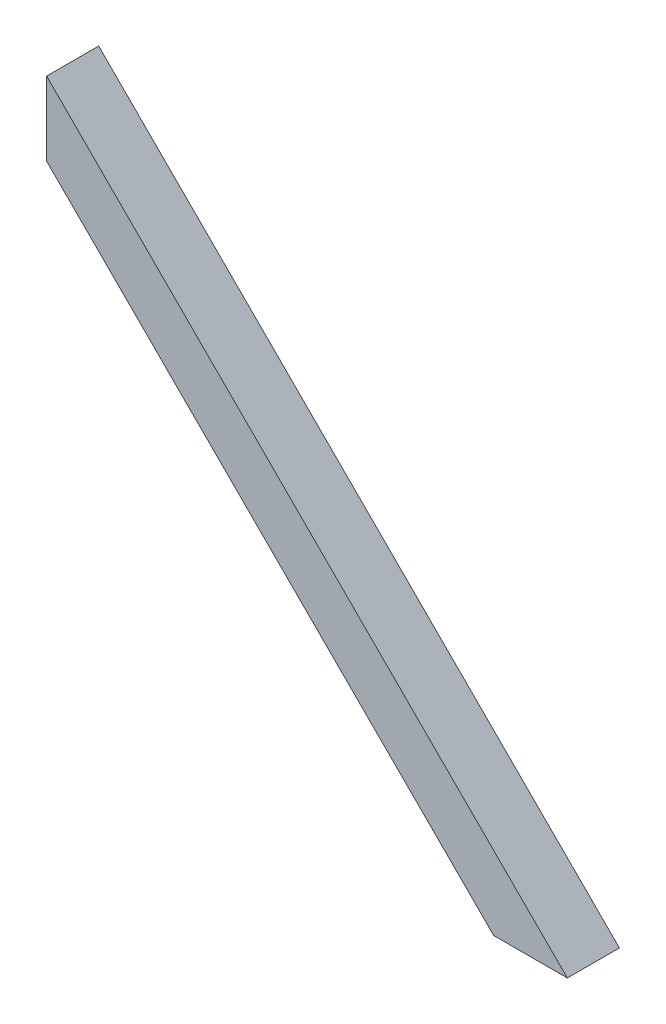
ISO-10303-21;
HEADER;
FILE_DESCRIPTION(('STEP AP214'),'2;1');
FILE_NAME('part.step','',(''),(''),'','','');
FILE_SCHEMA(('AUTOMOTIVE_DESIGN { 1 0 10303 214 1 1 1 1 }'));
ENDSEC;
DATA;
#1=APPLICATION_CONTEXT('core data for automotive mechanical design processes');
#2=APPLICATION_PROTOCOL_DEFINITION('international standard','automotive_design',2000,#1);
#3=PRODUCT_CONTEXT('',#1,'mechanical');
#4=PRODUCT('Part','Part','',(#3));
#5=PRODUCT_RELATED_PRODUCT_CATEGORY('part','',(#4));
#6=PRODUCT_DEFINITION_FORMATION('','',#4);
#7=PRODUCT_DEFINITION_CONTEXT('part definition',#1,'design');
#8=PRODUCT_DEFINITION('design','',#6,#7);
#9=PRODUCT_DEFINITION_SHAPE('','',#8);
#10=(LENGTH_UNIT() NAMED_UNIT(*) SI_UNIT(.MILLI.,.METRE.));
#11=(NAMED_UNIT(*) PLANE_ANGLE_UNIT() SI_UNIT($,.RADIAN.));
#12=(NAMED_UNIT(*) SI_UNIT($,.STERADIAN.) SOLID_ANGLE_UNIT());
#13=UNCERTAINTY_MEASURE_WITH_UNIT(LENGTH_MEASURE(1.E-05),#10,'distance_accuracy_value','');
#14=(GEOMETRIC_REPRESENTATION_CONTEXT(3) GLOBAL_UNCERTAINTY_ASSIGNED_CONTEXT((#13)) GLOBAL_UNIT_ASSIGNED_CONTEXT((#10,
#11,#12)) REPRESENTATION_CONTEXT('',''));
#15=CARTESIAN_POINT('',(0.,0.,0.));
#16=DIRECTION('',(0.,0.,1.));
#17=DIRECTION('',(1.,0.,0.));
#18=AXIS2_PLACEMENT_3D('',#15,#16,#17);
#19=CARTESIAN_POINT('',(0.,0.,30.));
#20=DIRECTION('',(1.,0.,0.));
#21=DIRECTION('',(0.,1.,0.));
#22=AXIS2_PLACEMENT_3D('',#19,#20,#21);
#23=PLANE('',#22);
#24=DIRECTION('',(0.,-1.,0.));
#25=VECTOR('',#24,1.);
#26=CARTESIAN_POINT('',(0.,0.,0.));
#27=LINE('',#26,#25);
#28=CARTESIAN_POINT('',(0.,300.,0.));
#29=VERTEX_POINT('',#28);
#30=CARTESIAN_POINT('',(0.,257.573593128807,0.));
#31=VERTEX_POINT('',#30);
#32=EDGE_CURVE('E100',#29,#31,#27,.T.);
#33=ORIENTED_EDGE('',*,*,#32,.T.);
#34=DIRECTION('',(0.,0.,-1.));
#35=VECTOR('',#34,1.);
#36=CARTESIAN_POINT('',(0.,257.573593128807,30.));
#37=LINE('',#36,#35);
#38=CARTESIAN_POINT('',(0.,257.573593128807,30.));
#39=VERTEX_POINT('',#38);
#40=EDGE_CURVE('E11',#39,#31,#37,.T.);
#41=ORIENTED_EDGE('',*,*,#40,.F.);
#42=DIRECTION('',(0.,-1.,0.));
#43=VECTOR('',#42,1.);
#44=CARTESIAN_POINT('',(0.,0.,30.));
#45=LINE('',#44,#43);
#46=CARTESIAN_POINT('',(0.,300.,30.));
#47=VERTEX_POINT('',#46);
#48=EDGE_CURVE('E88',#47,#39,#45,.T.);
#49=ORIENTED_EDGE('',*,*,#48,.F.);
#50=DIRECTION('',(0.,0.,-1.));
#51=VECTOR('',#50,1.);
#52=CARTESIAN_POINT('',(0.,300.,30.));
#53=LINE('',#52,#51);
#54=EDGE_CURVE('E96',#47,#29,#53,.T.);
#55=ORIENTED_EDGE('',*,*,#54,.T.);
#56=EDGE_LOOP('',(#33,#41,#49,#55));
#57=FACE_BOUND('',#56,.T.);
#58=ADVANCED_FACE('F37',(#57),#23,.F.);
#59=CARTESIAN_POINT('',(128.786796564404,128.786796564404,30.));
#60=DIRECTION('',(0.707106781186547,0.707106781186547,0.));
#61=DIRECTION('',(-0.707106781186548,0.707106781186548,0.));
#62=AXIS2_PLACEMENT_3D('',#59,#60,#61);
#63=PLANE('',#62);
#64=DIRECTION('',(0.707106781186548,-0.707106781186548,0.));
#65=VECTOR('',#64,1.);
#66=CARTESIAN_POINT('',(128.786796564404,128.786796564404,0.));
#67=LINE('',#66,#65);
#68=CARTESIAN_POINT('',(257.573593128807,0.,0.));
#69=VERTEX_POINT('',#68);
#70=EDGE_CURVE('E92',#31,#69,#67,.T.);
#71=ORIENTED_EDGE('',*,*,#70,.T.);
#72=DIRECTION('',(0.,0.,-1.));
#73=VECTOR('',#72,1.);
#74=CARTESIAN_POINT('',(257.573593128807,0.,30.));
#75=LINE('',#74,#73);
#76=CARTESIAN_POINT('',(257.573593128807,0.,30.));
#77=VERTEX_POINT('',#76);
#78=EDGE_CURVE('E45',#77,#69,#75,.T.);
#79=ORIENTED_EDGE('',*,*,#78,.F.);
#80=DIRECTION('',(0.707106781186548,-0.707106781186548,0.));
#81=VECTOR('',#80,1.);
#82=CARTESIAN_POINT('',(128.786796564404,128.786796564404,30.));
#83=LINE('',#82,#81);
#84=EDGE_CURVE('E83',#39,#77,#83,.T.);
#85=ORIENTED_EDGE('',*,*,#84,.F.);
#86=ORIENTED_EDGE('',*,*,#40,.T.);
#87=EDGE_LOOP('',(#71,#79,#85,#86));
#88=FACE_BOUND('',#87,.T.);
#89=ADVANCED_FACE('F91',(#88),#63,.F.);
#90=CARTESIAN_POINT('',(0.,0.,30.));
#91=DIRECTION('',(0.,1.,0.));
#92=DIRECTION('',(0.,0.,1.));
#93=AXIS2_PLACEMENT_3D('',#90,#91,#92);
#94=PLANE('',#93);
#95=DIRECTION('',(1.,0.,0.));
#96=VECTOR('',#95,1.);
#97=CARTESIAN_POINT('',(0.,0.,0.));
#98=LINE('',#97,#96);
#99=CARTESIAN_POINT('',(300.,0.,0.));
#100=VERTEX_POINT('',#99);
#101=EDGE_CURVE('E70',#69,#100,#98,.T.);
#102=ORIENTED_EDGE('',*,*,#101,.T.);
#103=DIRECTION('',(0.,0.,-1.));
#104=VECTOR('',#103,1.);
#105=CARTESIAN_POINT('',(300.,0.,30.));
#106=LINE('',#105,#104);
#107=CARTESIAN_POINT('',(300.,0.,30.));
#108=VERTEX_POINT('',#107);
#109=EDGE_CURVE('E93',#108,#100,#106,.T.);
#110=ORIENTED_EDGE('',*,*,#109,.F.);
#111=DIRECTION('',(1.,0.,0.));
#112=VECTOR('',#111,1.);
#113=CARTESIAN_POINT('',(0.,0.,30.));
#114=LINE('',#113,#112);
#115=EDGE_CURVE('E86',#77,#108,#114,.T.);
#116=ORIENTED_EDGE('',*,*,#115,.F.);
#117=ORIENTED_EDGE('',*,*,#78,.T.);
#118=EDGE_LOOP('',(#102,#110,#116,#117));
#119=FACE_BOUND('',#118,.T.);
#120=ADVANCED_FACE('F94',(#119),#94,.F.);
#121=CARTESIAN_POINT('',(150.,150.,30.));
#122=DIRECTION('',(-0.707106781186547,-0.707106781186547,0.));
#123=DIRECTION('',(0.707106781186548,-0.707106781186548,0.));
#124=AXIS2_PLACEMENT_3D('',#121,#122,#123);
#125=PLANE('',#124);
#126=DIRECTION('',(-0.707106781186548,0.707106781186548,0.));
#127=VECTOR('',#126,1.);
#128=CARTESIAN_POINT('',(150.,150.,0.));
#129=LINE('',#128,#127);
#130=EDGE_CURVE('E76',#100,#29,#129,.T.);
#131=ORIENTED_EDGE('',*,*,#130,.T.);
#132=ORIENTED_EDGE('',*,*,#54,.F.);
#133=DIRECTION('',(-0.707106781186548,0.707106781186548,0.));
#134=VECTOR('',#133,1.);
#135=CARTESIAN_POINT('',(150.,150.,30.));
#136=LINE('',#135,#134);
#137=EDGE_CURVE('E53',#108,#47,#136,.T.);
#138=ORIENTED_EDGE('',*,*,#137,.F.);
#139=ORIENTED_EDGE('',*,*,#109,.T.);
#140=EDGE_LOOP('',(#131,#132,#138,#139));
#141=FACE_BOUND('',#140,.T.);
#142=ADVANCED_FACE('F107',(#141),#125,.F.);
#143=CARTESIAN_POINT('',(0.,0.,30.));
#144=DIRECTION('',(0.,0.,1.));
#145=DIRECTION('',(1.,0.,0.));
#146=AXIS2_PLACEMENT_3D('',#143,#144,#145);
#147=PLANE('',#146);
#148=ORIENTED_EDGE('',*,*,#48,.T.);
#149=ORIENTED_EDGE('',*,*,#84,.T.);
#150=ORIENTED_EDGE('',*,*,#115,.T.);
#151=ORIENTED_EDGE('',*,*,#137,.T.);
#152=EDGE_LOOP('',(#148,#149,#150,#151));
#153=FACE_BOUND('',#152,.T.);
#154=ADVANCED_FACE('F84',(#153),#147,.T.);
#155=CARTESIAN_POINT('',(0.,0.,0.));
#156=DIRECTION('',(0.,0.,1.));
#157=DIRECTION('',(1.,0.,0.));
#158=AXIS2_PLACEMENT_3D('',#155,#156,#157);
#159=PLANE('',#158);
#160=ORIENTED_EDGE('',*,*,#32,.F.);
#161=ORIENTED_EDGE('',*,*,#130,.F.);
#162=ORIENTED_EDGE('',*,*,#101,.F.);
#163=ORIENTED_EDGE('',*,*,#70,.F.);
#164=EDGE_LOOP('',(#160,#161,#162,#163));
#165=FACE_BOUND('',#164,.T.);
#166=ADVANCED_FACE('F110',(#165),#159,.F.);
#167=CLOSED_SHELL('',(#58,#89,#120,#142,#154,#166));
#168=MANIFOLD_SOLID_BREP('B2',#167);
#169=ADVANCED_BREP_SHAPE_REPRESENTATION('',(#18,#168),#14);
#170=SHAPE_DEFINITION_REPRESENTATION(#9,#169);
ENDSEC;
END-ISO-10303-21;
